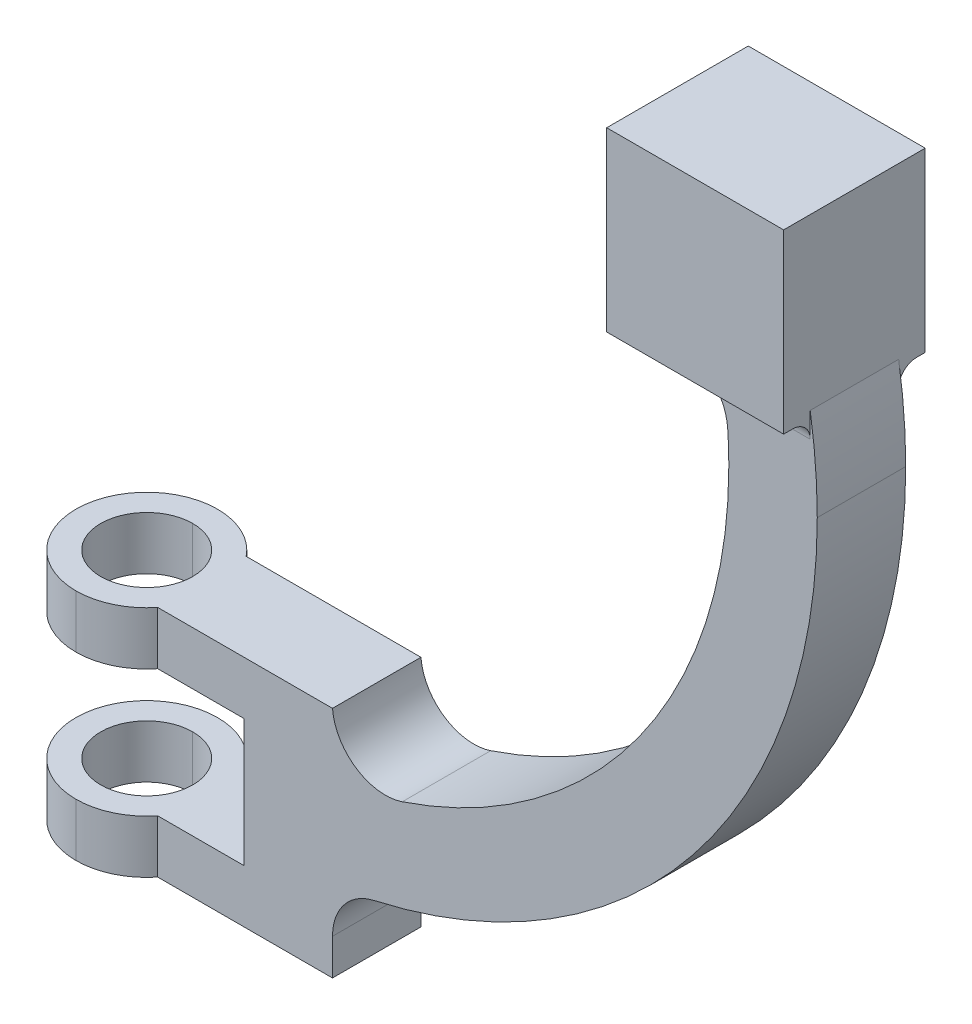
ISO-10303-21;
HEADER;
FILE_DESCRIPTION(('STEP AP214'),'2;1');
FILE_NAME('part.step','',(''),(''),'','','');
FILE_SCHEMA(('AUTOMOTIVE_DESIGN { 1 0 10303 214 1 1 1 1 }'));
ENDSEC;
DATA;
#1=APPLICATION_CONTEXT('core data for automotive mechanical design processes');
#2=APPLICATION_PROTOCOL_DEFINITION('international standard','automotive_design',2000,#1);
#3=PRODUCT_CONTEXT('',#1,'mechanical');
#4=PRODUCT('Part','Part','',(#3));
#5=PRODUCT_RELATED_PRODUCT_CATEGORY('part','',(#4));
#6=PRODUCT_DEFINITION_FORMATION('','',#4);
#7=PRODUCT_DEFINITION_CONTEXT('part definition',#1,'design');
#8=PRODUCT_DEFINITION('design','',#6,#7);
#9=PRODUCT_DEFINITION_SHAPE('','',#8);
#10=(LENGTH_UNIT() NAMED_UNIT(*) SI_UNIT(.MILLI.,.METRE.));
#11=(NAMED_UNIT(*) PLANE_ANGLE_UNIT() SI_UNIT($,.RADIAN.));
#12=(NAMED_UNIT(*) SI_UNIT($,.STERADIAN.) SOLID_ANGLE_UNIT());
#13=UNCERTAINTY_MEASURE_WITH_UNIT(LENGTH_MEASURE(1.E-05),#10,'distance_accuracy_value','');
#14=(GEOMETRIC_REPRESENTATION_CONTEXT(3) GLOBAL_UNCERTAINTY_ASSIGNED_CONTEXT((#13)) GLOBAL_UNIT_ASSIGNED_CONTEXT((#10,
#11,#12)) REPRESENTATION_CONTEXT('',''));
#15=CARTESIAN_POINT('',(0.,0.,0.));
#16=DIRECTION('',(0.,0.,1.));
#17=DIRECTION('',(1.,0.,0.));
#18=AXIS2_PLACEMENT_3D('',#15,#16,#17);
#19=CARTESIAN_POINT('',(24.3445862721124,31.2695526217005,-2.5));
#20=DIRECTION('',(0.,0.,1.));
#21=DIRECTION('',(1.,0.,0.));
#22=AXIS2_PLACEMENT_3D('',#19,#20,#21);
#23=CYLINDRICAL_SURFACE('',#22,3.);
#24=CARTESIAN_POINT('',(24.3445862721124,31.2695526217005,-2.5));
#25=DIRECTION('',(0.,0.,1.));
#26=DIRECTION('',(-1.,0.,0.));
#27=AXIS2_PLACEMENT_3D('',#24,#25,#26);
#28=CIRCLE('',#27,3.);
#29=CARTESIAN_POINT('',(27.3376388767794,31.4736018944161,-2.5));
#30=VERTEX_POINT('',#29);
#31=CARTESIAN_POINT('',(26.5806542496121,33.2695526217005,-2.5));
#32=VERTEX_POINT('',#31);
#33=EDGE_CURVE('E410',#30,#32,#28,.T.);
#34=ORIENTED_EDGE('',*,*,#33,.F.);
#35=DIRECTION('',(0.,0.,-1.));
#36=VECTOR('',#35,1.);
#37=CARTESIAN_POINT('',(27.3376388767794,31.4736018944161,-2.5));
#38=LINE('',#37,#36);
#39=CARTESIAN_POINT('',(27.3376388767794,31.4736018944161,2.5));
#40=VERTEX_POINT('',#39);
#41=EDGE_CURVE('E369',#40,#30,#38,.T.);
#42=ORIENTED_EDGE('',*,*,#41,.F.);
#43=CARTESIAN_POINT('',(24.3445862721124,31.2695526217005,2.5));
#44=DIRECTION('',(0.,0.,-1.));
#45=DIRECTION('',(1.,0.,0.));
#46=AXIS2_PLACEMENT_3D('',#43,#44,#45);
#47=CIRCLE('',#46,3.);
#48=CARTESIAN_POINT('',(26.5806542496121,33.2695526217005,2.5));
#49=VERTEX_POINT('',#48);
#50=EDGE_CURVE('E438',#49,#40,#47,.T.);
#51=ORIENTED_EDGE('',*,*,#50,.F.);
#52=CARTESIAN_POINT('',(26.5806542496121,33.2695526217005,2.5));
#53=CARTESIAN_POINT('',(26.5523435658199,33.3012104989178,2.50000455551072));
#54=CARTESIAN_POINT('',(26.5233748537477,33.3322400660775,2.50150263052097));
#55=CARTESIAN_POINT('',(26.4643136883192,33.3928847942062,2.50716698518481));
#56=CARTESIAN_POINT('',(26.4342227101048,33.4225017028365,2.51132987097531));
#57=CARTESIAN_POINT('',(26.3429064194618,33.5086788959668,2.52726423180945));
#58=CARTESIAN_POINT('',(26.2802051071374,33.5630474688072,2.5424913092058));
#59=CARTESIAN_POINT('',(26.1097307736497,33.6991139789296,2.592437017818));
#60=CARTESIAN_POINT('',(25.9994122176084,33.7752972547978,2.63338882471228));
#61=CARTESIAN_POINT('',(25.7733586349941,33.9107898996237,2.7281873059139));
#62=CARTESIAN_POINT('',(25.6575939980268,33.9699905357896,2.78211317833401));
#63=CARTESIAN_POINT('',(25.4568714388266,34.0572215456473,2.88145907332466));
#64=CARTESIAN_POINT('',(25.3726347395481,34.0893193025895,2.92486125147377));
#65=CARTESIAN_POINT('',(25.2030733912598,34.1454846238481,3.0146643361152));
#66=CARTESIAN_POINT('',(25.117748215783,34.1695481365092,3.06106674158013));
#67=CARTESIAN_POINT('',(24.8611483140865,34.2299555293475,3.20303658057069));
#68=CARTESIAN_POINT('',(24.6886679116238,34.2547628551567,3.30166601961782));
#69=CARTESIAN_POINT('',(24.4621293793442,34.267736667999,3.43214230188662));
#70=CARTESIAN_POINT('',(24.4081050532393,34.2693667879832,3.46332773518254));
#71=CARTESIAN_POINT('',(24.350910857615,34.269547619792,3.49634849414372));
#72=CARTESIAN_POINT('',(24.3477485783026,34.2695526195202,3.49817423684651));
#73=CARTESIAN_POINT('',(24.3445862721124,34.2695526217005,3.5));
#74=B_SPLINE_CURVE_WITH_KNOTS('',3,(#52,#53,#54,#55,#56,#57,#58,#59,#60,#61,#62,#63,#64,#65,#66,
#67,#68,#69,#70,#71,#72,#73),.UNSPECIFIED.,.F.,.F.,(4,2,2,2,2,2,2,2,2,2,4),(0.,
0.127328124372166,0.254494407314541,0.506902758847991,0.92515434749421,1.34602692875663,
1.64578712718784,1.94569826663473,2.54344782717996,2.73062158792369,2.74157604934411),.UNSPECIFIED.);
#75=CARTESIAN_POINT('',(24.3445862721124,34.2695526217005,3.5));
#76=VERTEX_POINT('',#75);
#77=EDGE_CURVE('E612',#49,#76,#74,.T.);
#78=ORIENTED_EDGE('',*,*,#77,.T.);
#79=DIRECTION('',(0.,0.,1.));
#80=VECTOR('',#79,1.);
#81=CARTESIAN_POINT('',(24.3445862721124,34.2695526217005,2.5));
#82=LINE('',#81,#80);
#83=CARTESIAN_POINT('',(24.3445862721124,34.2695526217005,-3.5));
#84=VERTEX_POINT('',#83);
#85=EDGE_CURVE('E310',#84,#76,#82,.T.);
#86=ORIENTED_EDGE('',*,*,#85,.F.);
#87=CARTESIAN_POINT('',(26.5806542496121,33.2695526217005,-2.5));
#88=CARTESIAN_POINT('',(26.5523435658199,33.3012104989178,-2.50000455551072));
#89=CARTESIAN_POINT('',(26.5233748537477,33.3322400660775,-2.50150263052097));
#90=CARTESIAN_POINT('',(26.4643136883192,33.3928847942062,-2.50716698518481));
#91=CARTESIAN_POINT('',(26.4342227101048,33.4225017028365,-2.51132987097531));
#92=CARTESIAN_POINT('',(26.3429064194618,33.5086788959668,-2.52726423180945));
#93=CARTESIAN_POINT('',(26.2802051071374,33.5630474688072,-2.5424913092058));
#94=CARTESIAN_POINT('',(26.1097307736497,33.6991139789296,-2.592437017818));
#95=CARTESIAN_POINT('',(25.9994122176084,33.7752972547978,-2.63338882471228));
#96=CARTESIAN_POINT('',(25.7733586349941,33.9107898996237,-2.7281873059139));
#97=CARTESIAN_POINT('',(25.6575939980268,33.9699905357896,-2.78211317833401));
#98=CARTESIAN_POINT('',(25.4568714388266,34.0572215456473,-2.88145907332466));
#99=CARTESIAN_POINT('',(25.3726347395481,34.0893193025895,-2.92486125147377));
#100=CARTESIAN_POINT('',(25.2030733912598,34.1454846238481,-3.0146643361152));
#101=CARTESIAN_POINT('',(25.117748215783,34.1695481365092,-3.06106674158013));
#102=CARTESIAN_POINT('',(24.8611483140865,34.2299555293475,-3.20303658057069));
#103=CARTESIAN_POINT('',(24.6886679116238,34.2547628551567,-3.30166601961782));
#104=CARTESIAN_POINT('',(24.4621293793442,34.267736667999,-3.43214230188662));
#105=CARTESIAN_POINT('',(24.4081050532393,34.2693667879832,-3.46332773518254));
#106=CARTESIAN_POINT('',(24.350910857615,34.269547619792,-3.49634849414372));
#107=CARTESIAN_POINT('',(24.3477485783026,34.2695526195202,-3.49817423684651));
#108=CARTESIAN_POINT('',(24.3445862721124,34.2695526217005,-3.5));
#109=B_SPLINE_CURVE_WITH_KNOTS('',3,(#87,#88,#89,#90,#91,#92,#93,#94,#95,#96,#97,#98,#99,#100,
#101,#102,#103,#104,#105,#106,#107,#108),.UNSPECIFIED.,.F.,.F.,(4,2,2,2,2,2,2,2,2,2,4),(0.,
0.127328124372166,0.254494407314541,0.506902758847991,0.92515434749421,1.34602692875663,
1.64578712718784,1.94569826663473,2.54344782717996,2.73062158792369,2.74157604934411),.UNSPECIFIED.);
#110=EDGE_CURVE('E56',#84,#32,#109,.F.);
#111=ORIENTED_EDGE('',*,*,#110,.T.);
#112=EDGE_LOOP('',(#34,#42,#51,#78,#86,#111));
#113=FACE_BOUND('',#112,.T.);
#114=ADVANCED_FACE('F47',(#113),#23,.F.);
#115=CARTESIAN_POINT('',(7.99027700327415,6.84133678478349,-2.5));
#116=DIRECTION('',(0.,0.,1.));
#117=DIRECTION('',(1.,0.,0.));
#118=AXIS2_PLACEMENT_3D('',#115,#116,#117);
#119=CYLINDRICAL_SURFACE('',#118,3.);
#120=CARTESIAN_POINT('',(7.99027700327415,6.84133678478349,-2.5));
#121=DIRECTION('',(0.,0.,1.));
#122=DIRECTION('',(-1.,0.,0.));
#123=AXIS2_PLACEMENT_3D('',#120,#121,#122);
#124=CIRCLE('',#123,3.);
#125=CARTESIAN_POINT('',(5.,6.6,-2.5));
#126=VERTEX_POINT('',#125);
#127=CARTESIAN_POINT('',(8.94201980309237,3.99630855241143,-2.5));
#128=VERTEX_POINT('',#127);
#129=EDGE_CURVE('E361',#126,#128,#124,.T.);
#130=ORIENTED_EDGE('',*,*,#129,.F.);
#131=DIRECTION('',(0.,0.,-1.));
#132=VECTOR('',#131,1.);
#133=CARTESIAN_POINT('',(5.,6.6,2.5));
#134=LINE('',#133,#132);
#135=CARTESIAN_POINT('',(5.,6.6,2.5));
#136=VERTEX_POINT('',#135);
#137=EDGE_CURVE('E344',#136,#126,#134,.T.);
#138=ORIENTED_EDGE('',*,*,#137,.F.);
#139=CARTESIAN_POINT('',(7.99027700327415,6.84133678478349,2.5));
#140=DIRECTION('',(0.,0.,-1.));
#141=DIRECTION('',(1.,0.,0.));
#142=AXIS2_PLACEMENT_3D('',#139,#140,#141);
#143=CIRCLE('',#142,3.);
#144=CARTESIAN_POINT('',(8.94201980309237,3.99630855241143,2.5));
#145=VERTEX_POINT('',#144);
#146=EDGE_CURVE('E487',#145,#136,#143,.T.);
#147=ORIENTED_EDGE('',*,*,#146,.F.);
#148=DIRECTION('',(0.,0.,1.));
#149=VECTOR('',#148,1.);
#150=CARTESIAN_POINT('',(8.94201980309237,3.99630855241142,-2.5));
#151=LINE('',#150,#149);
#152=EDGE_CURVE('E464',#128,#145,#151,.T.);
#153=ORIENTED_EDGE('',*,*,#152,.F.);
#154=EDGE_LOOP('',(#130,#138,#147,#153));
#155=FACE_BOUND('',#154,.T.);
#156=ADVANCED_FACE('F655',(#155),#119,.F.);
#157=CARTESIAN_POINT('',(8.,-4.55824954074391,-2.5));
#158=DIRECTION('',(0.,0.,1.));
#159=DIRECTION('',(1.,0.,0.));
#160=AXIS2_PLACEMENT_3D('',#157,#158,#159);
#161=CYLINDRICAL_SURFACE('',#160,3.);
#162=CARTESIAN_POINT('',(8.,-4.55824954074391,-2.5));
#163=DIRECTION('',(0.,0.,1.));
#164=DIRECTION('',(-1.,0.,0.));
#165=AXIS2_PLACEMENT_3D('',#162,#163,#164);
#166=CIRCLE('',#165,3.);
#167=CARTESIAN_POINT('',(7.34624478397976,-1.63034856606489,-2.5));
#168=VERTEX_POINT('',#167);
#169=CARTESIAN_POINT('',(5.,-4.55824954074391,-2.5));
#170=VERTEX_POINT('',#169);
#171=EDGE_CURVE('E422',#168,#170,#166,.T.);
#172=ORIENTED_EDGE('',*,*,#171,.F.);
#173=DIRECTION('',(0.,0.,-1.));
#174=VECTOR('',#173,1.);
#175=CARTESIAN_POINT('',(7.34624478397976,-1.63034856606489,-2.5));
#176=LINE('',#175,#174);
#177=CARTESIAN_POINT('',(7.34624478397976,-1.63034856606489,2.5));
#178=VERTEX_POINT('',#177);
#179=EDGE_CURVE('E367',#178,#168,#176,.T.);
#180=ORIENTED_EDGE('',*,*,#179,.F.);
#181=CARTESIAN_POINT('',(8.,-4.55824954074391,2.5));
#182=DIRECTION('',(0.,0.,-1.));
#183=DIRECTION('',(1.,0.,0.));
#184=AXIS2_PLACEMENT_3D('',#181,#182,#183);
#185=CIRCLE('',#184,3.);
#186=CARTESIAN_POINT('',(5.,-4.55824954074391,2.5));
#187=VERTEX_POINT('',#186);
#188=EDGE_CURVE('E451',#187,#178,#185,.T.);
#189=ORIENTED_EDGE('',*,*,#188,.F.);
#190=DIRECTION('',(0.,0.,1.));
#191=VECTOR('',#190,1.);
#192=CARTESIAN_POINT('',(5.,-4.55824954074391,2.5));
#193=LINE('',#192,#191);
#194=EDGE_CURVE('E515',#170,#187,#193,.T.);
#195=ORIENTED_EDGE('',*,*,#194,.F.);
#196=EDGE_LOOP('',(#172,#180,#189,#195));
#197=FACE_BOUND('',#196,.T.);
#198=ADVANCED_FACE('F661',(#197),#161,.F.);
#199=CARTESIAN_POINT('',(22.,34.2695526217005,-2.5));
#200=DIRECTION('',(-1.,0.,0.));
#201=DIRECTION('',(0.,0.,1.));
#202=AXIS2_PLACEMENT_3D('',#199,#200,#201);
#203=PLANE('',#202);
#204=DIRECTION('',(0.,1.,0.));
#205=VECTOR('',#204,1.);
#206=CARTESIAN_POINT('',(22.,44.2695526217005,-4.));
#207=LINE('',#206,#205);
#208=CARTESIAN_POINT('',(22.,34.2695526217005,-4.));
#209=VERTEX_POINT('',#208);
#210=CARTESIAN_POINT('',(22.,44.2695526217005,-4.));
#211=VERTEX_POINT('',#210);
#212=EDGE_CURVE('E303',#209,#211,#207,.T.);
#213=ORIENTED_EDGE('',*,*,#212,.F.);
#214=DIRECTION('',(0.,0.,1.));
#215=VECTOR('',#214,1.);
#216=CARTESIAN_POINT('',(22.,34.2695526217005,-2.5));
#217=LINE('',#216,#215);
#218=CARTESIAN_POINT('',(22.,34.2695526217005,4.));
#219=VERTEX_POINT('',#218);
#220=EDGE_CURVE('E297',#209,#219,#217,.T.);
#221=ORIENTED_EDGE('',*,*,#220,.T.);
#222=DIRECTION('',(0.,-1.,0.));
#223=VECTOR('',#222,1.);
#224=CARTESIAN_POINT('',(22.,44.2695526217005,4.));
#225=LINE('',#224,#223);
#226=CARTESIAN_POINT('',(22.,44.2695526217005,4.));
#227=VERTEX_POINT('',#226);
#228=EDGE_CURVE('E300',#227,#219,#225,.T.);
#229=ORIENTED_EDGE('',*,*,#228,.F.);
#230=DIRECTION('',(0.,0.,1.));
#231=VECTOR('',#230,1.);
#232=CARTESIAN_POINT('',(22.,44.2695526217005,-2.5));
#233=LINE('',#232,#231);
#234=EDGE_CURVE('E349',#211,#227,#233,.T.);
#235=ORIENTED_EDGE('',*,*,#234,.F.);
#236=EDGE_LOOP('',(#213,#221,#229,#235));
#237=FACE_BOUND('',#236,.T.);
#238=ADVANCED_FACE('F299',(#237),#203,.T.);
#239=CARTESIAN_POINT('',(22.,34.2695526217005,-2.5));
#240=DIRECTION('',(0.,-1.,0.));
#241=DIRECTION('',(0.,0.,-1.));
#242=AXIS2_PLACEMENT_3D('',#239,#240,#241);
#243=PLANE('',#242);
#244=ORIENTED_EDGE('',*,*,#85,.T.);
#245=DIRECTION('',(1.,0.,0.));
#246=VECTOR('',#245,1.);
#247=CARTESIAN_POINT('',(32.,34.2695526217005,3.5));
#248=LINE('',#247,#246);
#249=CARTESIAN_POINT('',(32.,34.2695526217005,3.5));
#250=VERTEX_POINT('',#249);
#251=EDGE_CURVE('E603',#76,#250,#248,.T.);
#252=ORIENTED_EDGE('',*,*,#251,.T.);
#253=DIRECTION('',(0.,0.,-1.));
#254=VECTOR('',#253,1.);
#255=CARTESIAN_POINT('',(32.,34.2695526217005,4.));
#256=LINE('',#255,#254);
#257=CARTESIAN_POINT('',(32.,34.2695526217005,4.));
#258=VERTEX_POINT('',#257);
#259=EDGE_CURVE('E325',#258,#250,#256,.T.);
#260=ORIENTED_EDGE('',*,*,#259,.F.);
#261=DIRECTION('',(1.,0.,0.));
#262=VECTOR('',#261,1.);
#263=CARTESIAN_POINT('',(22.,34.2695526217005,4.));
#264=LINE('',#263,#262);
#265=EDGE_CURVE('E316',#219,#258,#264,.T.);
#266=ORIENTED_EDGE('',*,*,#265,.F.);
#267=ORIENTED_EDGE('',*,*,#220,.F.);
#268=DIRECTION('',(1.,0.,0.));
#269=VECTOR('',#268,1.);
#270=CARTESIAN_POINT('',(22.,34.2695526217005,-4.));
#271=LINE('',#270,#269);
#272=CARTESIAN_POINT('',(32.,34.2695526217005,-4.));
#273=VERTEX_POINT('',#272);
#274=EDGE_CURVE('E326',#209,#273,#271,.T.);
#275=ORIENTED_EDGE('',*,*,#274,.T.);
#276=CARTESIAN_POINT('',(32.,34.2695526217005,-3.5));
#277=VERTEX_POINT('',#276);
#278=EDGE_CURVE('E683',#277,#273,#256,.T.);
#279=ORIENTED_EDGE('',*,*,#278,.F.);
#280=DIRECTION('',(-1.,0.,0.));
#281=VECTOR('',#280,1.);
#282=CARTESIAN_POINT('',(24.3445862721124,34.2695526217005,-3.5));
#283=LINE('',#282,#281);
#284=EDGE_CURVE('E309',#277,#84,#283,.T.);
#285=ORIENTED_EDGE('',*,*,#284,.T.);
#286=EDGE_LOOP('',(#244,#252,#260,#266,#267,#275,#279,#285));
#287=FACE_BOUND('',#286,.T.);
#288=ADVANCED_FACE('F322',(#287),#243,.T.);
#289=CARTESIAN_POINT('',(0.365223689149773,29.6347763108502,-2.5));
#290=DIRECTION('',(0.,0.,1.));
#291=DIRECTION('',(1.,0.,0.));
#292=AXIS2_PLACEMENT_3D('',#289,#290,#291);
#293=CYLINDRICAL_SURFACE('',#292,27.0350228514911);
#294=DIRECTION('',(0.,0.,1.));
#295=VECTOR('',#294,1.);
#296=CARTESIAN_POINT('',(27.4002465406409,29.6347763108502,-2.5));
#297=LINE('',#296,#295);
#298=CARTESIAN_POINT('',(27.4002465406409,29.6347763108502,-2.5));
#299=VERTEX_POINT('',#298);
#300=CARTESIAN_POINT('',(27.4002465406409,29.6347763108502,2.5));
#301=VERTEX_POINT('',#300);
#302=EDGE_CURVE('E378',#299,#301,#297,.T.);
#303=ORIENTED_EDGE('',*,*,#302,.F.);
#304=CARTESIAN_POINT('',(0.365223689149773,29.6347763108502,-2.5));
#305=DIRECTION('',(0.,0.,-1.));
#306=DIRECTION('',(-1.,0.,0.));
#307=AXIS2_PLACEMENT_3D('',#304,#305,#306);
#308=CIRCLE('',#307,27.0350228514911);
#309=EDGE_CURVE('E382',#299,#128,#308,.T.);
#310=ORIENTED_EDGE('',*,*,#309,.T.);
#311=ORIENTED_EDGE('',*,*,#152,.T.);
#312=CARTESIAN_POINT('',(0.365223689149773,29.6347763108502,2.5));
#313=DIRECTION('',(0.,0.,-1.));
#314=DIRECTION('',(-1.,0.,0.));
#315=AXIS2_PLACEMENT_3D('',#312,#313,#314);
#316=CIRCLE('',#315,27.0350228514911);
#317=EDGE_CURVE('E441',#301,#145,#316,.T.);
#318=ORIENTED_EDGE('',*,*,#317,.F.);
#319=EDGE_LOOP('',(#303,#310,#311,#318));
#320=FACE_BOUND('',#319,.T.);
#321=ADVANCED_FACE('F676',(#320),#293,.F.);
#322=CARTESIAN_POINT('',(0.365223689149773,29.6347763108502,-2.5));
#323=DIRECTION('',(0.,0.,1.));
#324=DIRECTION('',(1.,0.,0.));
#325=AXIS2_PLACEMENT_3D('',#322,#323,#324);
#326=CYLINDRICAL_SURFACE('',#325,32.0350228514911);
#327=DIRECTION('',(0.,0.,1.));
#328=VECTOR('',#327,1.);
#329=CARTESIAN_POINT('',(32.4002465406409,29.6347763108502,-2.5));
#330=LINE('',#329,#328);
#331=CARTESIAN_POINT('',(32.4002465406409,29.6347763108502,-2.5));
#332=VERTEX_POINT('',#331);
#333=CARTESIAN_POINT('',(32.4002465406409,29.6347763108502,2.5));
#334=VERTEX_POINT('',#333);
#335=EDGE_CURVE('E368',#332,#334,#330,.T.);
#336=ORIENTED_EDGE('',*,*,#335,.F.);
#337=CARTESIAN_POINT('',(0.365223689149773,29.6347763108502,-2.5));
#338=DIRECTION('',(0.,0.,1.));
#339=DIRECTION('',(-1.,0.,0.));
#340=AXIS2_PLACEMENT_3D('',#337,#338,#339);
#341=CIRCLE('',#340,32.0350228514911);
#342=CARTESIAN_POINT('',(32.,34.6829063466187,-2.5));
#343=VERTEX_POINT('',#342);
#344=EDGE_CURVE('E399',#332,#343,#341,.T.);
#345=ORIENTED_EDGE('',*,*,#344,.T.);
#346=DIRECTION('',(0.,0.,1.));
#347=VECTOR('',#346,1.);
#348=CARTESIAN_POINT('',(32.,34.6829063466187,-2.5));
#349=LINE('',#348,#347);
#350=CARTESIAN_POINT('',(32.,34.6829063466187,2.5));
#351=VERTEX_POINT('',#350);
#352=EDGE_CURVE('E356',#343,#351,#349,.T.);
#353=ORIENTED_EDGE('',*,*,#352,.T.);
#354=CARTESIAN_POINT('',(0.365223689149773,29.6347763108502,2.5));
#355=DIRECTION('',(0.,0.,1.));
#356=DIRECTION('',(-1.,0.,0.));
#357=AXIS2_PLACEMENT_3D('',#354,#355,#356);
#358=CIRCLE('',#357,32.0350228514911);
#359=EDGE_CURVE('E446',#334,#351,#358,.T.);
#360=ORIENTED_EDGE('',*,*,#359,.F.);
#361=EDGE_LOOP('',(#336,#345,#353,#360));
#362=FACE_BOUND('',#361,.T.);
#363=ADVANCED_FACE('F702',(#362),#326,.T.);
#364=CARTESIAN_POINT('',(32.,44.2695526217005,-2.5));
#365=DIRECTION('',(1.,0.,0.));
#366=DIRECTION('',(0.,1.,0.));
#367=AXIS2_PLACEMENT_3D('',#364,#365,#366);
#368=PLANE('',#367);
#369=DIRECTION('',(0.,-1.,0.));
#370=VECTOR('',#369,1.);
#371=CARTESIAN_POINT('',(32.,-3.6,-2.5));
#372=LINE('',#371,#370);
#373=CARTESIAN_POINT('',(32.,33.2695526217005,-2.5));
#374=VERTEX_POINT('',#373);
#375=EDGE_CURVE('E62',#343,#374,#372,.T.);
#376=ORIENTED_EDGE('',*,*,#375,.T.);
#377=CARTESIAN_POINT('',(32.,33.2695526217005,-3.5));
#378=DIRECTION('',(1.,0.,0.));
#379=DIRECTION('',(0.,0.,-1.));
#380=AXIS2_PLACEMENT_3D('',#377,#378,#379);
#381=CIRCLE('',#380,1.);
#382=EDGE_CURVE('E11',#374,#277,#381,.F.);
#383=ORIENTED_EDGE('',*,*,#382,.T.);
#384=ORIENTED_EDGE('',*,*,#278,.T.);
#385=DIRECTION('',(0.,1.,0.));
#386=VECTOR('',#385,1.);
#387=CARTESIAN_POINT('',(32.,44.2695526217005,-4.));
#388=LINE('',#387,#386);
#389=CARTESIAN_POINT('',(32.,44.2695526217005,-4.));
#390=VERTEX_POINT('',#389);
#391=EDGE_CURVE('E320',#273,#390,#388,.T.);
#392=ORIENTED_EDGE('',*,*,#391,.T.);
#393=DIRECTION('',(0.,0.,1.));
#394=VECTOR('',#393,1.);
#395=CARTESIAN_POINT('',(32.,44.2695526217005,-2.5));
#396=LINE('',#395,#394);
#397=CARTESIAN_POINT('',(32.,44.2695526217005,4.));
#398=VERTEX_POINT('',#397);
#399=EDGE_CURVE('E352',#390,#398,#396,.T.);
#400=ORIENTED_EDGE('',*,*,#399,.T.);
#401=DIRECTION('',(0.,-1.,0.));
#402=VECTOR('',#401,1.);
#403=CARTESIAN_POINT('',(32.,44.2695526217005,4.));
#404=LINE('',#403,#402);
#405=EDGE_CURVE('E682',#398,#258,#404,.T.);
#406=ORIENTED_EDGE('',*,*,#405,.T.);
#407=ORIENTED_EDGE('',*,*,#259,.T.);
#408=CARTESIAN_POINT('',(32.,33.2695526217005,3.5));
#409=DIRECTION('',(1.,0.,0.));
#410=DIRECTION('',(0.,0.,-1.));
#411=AXIS2_PLACEMENT_3D('',#408,#409,#410);
#412=CIRCLE('',#411,1.);
#413=CARTESIAN_POINT('',(32.,33.2695526217005,2.5));
#414=VERTEX_POINT('',#413);
#415=EDGE_CURVE('E609',#250,#414,#412,.F.);
#416=ORIENTED_EDGE('',*,*,#415,.T.);
#417=DIRECTION('',(0.,1.,0.));
#418=VECTOR('',#417,1.);
#419=CARTESIAN_POINT('',(32.,-3.6,2.5));
#420=LINE('',#419,#418);
#421=EDGE_CURVE('E333',#414,#351,#420,.T.);
#422=ORIENTED_EDGE('',*,*,#421,.T.);
#423=ORIENTED_EDGE('',*,*,#352,.F.);
#424=EDGE_LOOP('',(#376,#383,#384,#392,#400,#406,#407,#416,#422,#423));
#425=FACE_BOUND('',#424,.T.);
#426=ADVANCED_FACE('F681',(#425),#368,.T.);
#427=CARTESIAN_POINT('',(22.,44.2695526217005,-2.5));
#428=DIRECTION('',(0.,1.,0.));
#429=DIRECTION('',(1.,0.,0.));
#430=AXIS2_PLACEMENT_3D('',#427,#428,#429);
#431=PLANE('',#430);
#432=ORIENTED_EDGE('',*,*,#234,.T.);
#433=DIRECTION('',(1.,0.,0.));
#434=VECTOR('',#433,1.);
#435=CARTESIAN_POINT('',(22.,44.2695526217005,4.));
#436=LINE('',#435,#434);
#437=EDGE_CURVE('E319',#227,#398,#436,.T.);
#438=ORIENTED_EDGE('',*,*,#437,.T.);
#439=ORIENTED_EDGE('',*,*,#399,.F.);
#440=DIRECTION('',(1.,0.,0.));
#441=VECTOR('',#440,1.);
#442=CARTESIAN_POINT('',(22.,44.2695526217005,-4.));
#443=LINE('',#442,#441);
#444=EDGE_CURVE('E328',#211,#390,#443,.T.);
#445=ORIENTED_EDGE('',*,*,#444,.F.);
#446=EDGE_LOOP('',(#432,#438,#439,#445));
#447=FACE_BOUND('',#446,.T.);
#448=ADVANCED_FACE('F694',(#447),#431,.T.);
#449=CARTESIAN_POINT('',(-8.,-6.6,0.));
#450=DIRECTION('',(0.,1.,0.));
#451=DIRECTION('',(0.,0.,1.));
#452=AXIS2_PLACEMENT_3D('',#449,#450,#451);
#453=CYLINDRICAL_SURFACE('',#452,2.6);
#454=DIRECTION('',(0.,1.,0.));
#455=VECTOR('',#454,1.);
#456=CARTESIAN_POINT('',(-8.,-6.6,-2.6));
#457=LINE('',#456,#455);
#458=CARTESIAN_POINT('',(-8.,-6.6,-2.6));
#459=VERTEX_POINT('',#458);
#460=CARTESIAN_POINT('',(-8.,-3.6,-2.6));
#461=VERTEX_POINT('',#460);
#462=EDGE_CURVE('E556',#459,#461,#457,.T.);
#463=ORIENTED_EDGE('',*,*,#462,.F.);
#464=CARTESIAN_POINT('',(-8.,-6.6,0.));
#465=DIRECTION('',(0.,-1.,0.));
#466=DIRECTION('',(0.,0.,-1.));
#467=AXIS2_PLACEMENT_3D('',#464,#465,#466);
#468=CIRCLE('',#467,2.6);
#469=CARTESIAN_POINT('',(-8.,-6.6,2.6));
#470=VERTEX_POINT('',#469);
#471=EDGE_CURVE('E389',#459,#470,#468,.T.);
#472=ORIENTED_EDGE('',*,*,#471,.T.);
#473=DIRECTION('',(0.,1.,0.));
#474=VECTOR('',#473,1.);
#475=CARTESIAN_POINT('',(-8.,-6.6,2.6));
#476=LINE('',#475,#474);
#477=CARTESIAN_POINT('',(-8.,-3.6,2.6));
#478=VERTEX_POINT('',#477);
#479=EDGE_CURVE('E411',#470,#478,#476,.T.);
#480=ORIENTED_EDGE('',*,*,#479,.T.);
#481=CARTESIAN_POINT('',(-8.,-3.6,0.));
#482=DIRECTION('',(0.,-1.,0.));
#483=DIRECTION('',(0.,0.,-1.));
#484=AXIS2_PLACEMENT_3D('',#481,#482,#483);
#485=CIRCLE('',#484,2.6);
#486=EDGE_CURVE('E353',#461,#478,#485,.T.);
#487=ORIENTED_EDGE('',*,*,#486,.F.);
#488=EDGE_LOOP('',(#463,#472,#480,#487));
#489=FACE_BOUND('',#488,.T.);
#490=ADVANCED_FACE('F747',(#489),#453,.F.);
#491=CARTESIAN_POINT('',(-8.,-6.6,0.));
#492=DIRECTION('',(0.,1.,0.));
#493=DIRECTION('',(0.,0.,1.));
#494=AXIS2_PLACEMENT_3D('',#491,#492,#493);
#495=CYLINDRICAL_SURFACE('',#494,4.);
#496=DIRECTION('',(0.,1.,0.));
#497=VECTOR('',#496,1.);
#498=CARTESIAN_POINT('',(-8.,-6.6,4.));
#499=LINE('',#498,#497);
#500=CARTESIAN_POINT('',(-8.,-6.6,4.));
#501=VERTEX_POINT('',#500);
#502=CARTESIAN_POINT('',(-8.,-3.6,4.));
#503=VERTEX_POINT('',#502);
#504=EDGE_CURVE('E390',#501,#503,#499,.T.);
#505=ORIENTED_EDGE('',*,*,#504,.F.);
#506=CARTESIAN_POINT('',(-8.,-6.6,0.));
#507=DIRECTION('',(0.,-1.,0.));
#508=DIRECTION('',(0.,0.,-1.));
#509=AXIS2_PLACEMENT_3D('',#506,#507,#508);
#510=CIRCLE('',#509,4.);
#511=CARTESIAN_POINT('',(-4.8775010008008,-6.6,2.5));
#512=VERTEX_POINT('',#511);
#513=EDGE_CURVE('E432',#512,#501,#510,.T.);
#514=ORIENTED_EDGE('',*,*,#513,.F.);
#515=DIRECTION('',(0.,1.,0.));
#516=VECTOR('',#515,1.);
#517=CARTESIAN_POINT('',(-4.8775010008008,-6.6,2.5));
#518=LINE('',#517,#516);
#519=CARTESIAN_POINT('',(-4.8775010008008,-3.6,2.5));
#520=VERTEX_POINT('',#519);
#521=EDGE_CURVE('E496',#512,#520,#518,.T.);
#522=ORIENTED_EDGE('',*,*,#521,.T.);
#523=CARTESIAN_POINT('',(-8.,-3.6,0.));
#524=DIRECTION('',(0.,-1.,0.));
#525=DIRECTION('',(0.,0.,-1.));
#526=AXIS2_PLACEMENT_3D('',#523,#524,#525);
#527=CIRCLE('',#526,4.);
#528=EDGE_CURVE('E386',#520,#503,#527,.T.);
#529=ORIENTED_EDGE('',*,*,#528,.T.);
#530=EDGE_LOOP('',(#505,#514,#522,#529));
#531=FACE_BOUND('',#530,.T.);
#532=ADVANCED_FACE('F744',(#531),#495,.T.);
#533=CARTESIAN_POINT('',(-8.,-3.6,0.));
#534=DIRECTION('',(0.,-1.,0.));
#535=DIRECTION('',(0.,0.,-1.));
#536=AXIS2_PLACEMENT_3D('',#533,#534,#535);
#537=PLANE('',#536);
#538=CARTESIAN_POINT('',(-8.,-3.6,0.));
#539=DIRECTION('',(0.,-1.,0.));
#540=DIRECTION('',(0.,0.,-1.));
#541=AXIS2_PLACEMENT_3D('',#538,#539,#540);
#542=CIRCLE('',#541,2.6);
#543=EDGE_CURVE('E416',#478,#461,#542,.T.);
#544=ORIENTED_EDGE('',*,*,#543,.T.);
#545=ORIENTED_EDGE('',*,*,#486,.T.);
#546=EDGE_LOOP('',(#544,#545));
#547=FACE_BOUND('',#546,.T.);
#548=DIRECTION('',(0.,0.,1.));
#549=VECTOR('',#548,1.);
#550=CARTESIAN_POINT('',(0.,-3.6,2.5));
#551=LINE('',#550,#549);
#552=CARTESIAN_POINT('',(0.,-3.6,-2.5));
#553=VERTEX_POINT('',#552);
#554=CARTESIAN_POINT('',(0.,-3.6,2.5));
#555=VERTEX_POINT('',#554);
#556=EDGE_CURVE('E529',#553,#555,#551,.T.);
#557=ORIENTED_EDGE('',*,*,#556,.F.);
#558=DIRECTION('',(1.,0.,0.));
#559=VECTOR('',#558,1.);
#560=CARTESIAN_POINT('',(-4.8775010008008,-3.6,-2.5));
#561=LINE('',#560,#559);
#562=CARTESIAN_POINT('',(-4.8775010008008,-3.6,-2.5));
#563=VERTEX_POINT('',#562);
#564=EDGE_CURVE('E406',#563,#553,#561,.T.);
#565=ORIENTED_EDGE('',*,*,#564,.F.);
#566=CARTESIAN_POINT('',(-8.,-3.6,0.));
#567=DIRECTION('',(0.,-1.,0.));
#568=DIRECTION('',(0.,0.,-1.));
#569=AXIS2_PLACEMENT_3D('',#566,#567,#568);
#570=CIRCLE('',#569,4.);
#571=CARTESIAN_POINT('',(-8.,-3.6,-4.));
#572=VERTEX_POINT('',#571);
#573=EDGE_CURVE('E472',#572,#563,#570,.T.);
#574=ORIENTED_EDGE('',*,*,#573,.F.);
#575=CARTESIAN_POINT('',(-8.,-3.6,0.));
#576=DIRECTION('',(0.,-1.,0.));
#577=DIRECTION('',(0.,0.,-1.));
#578=AXIS2_PLACEMENT_3D('',#575,#576,#577);
#579=CIRCLE('',#578,4.);
#580=EDGE_CURVE('E394',#503,#572,#579,.T.);
#581=ORIENTED_EDGE('',*,*,#580,.F.);
#582=ORIENTED_EDGE('',*,*,#528,.F.);
#583=DIRECTION('',(-1.,0.,0.));
#584=VECTOR('',#583,1.);
#585=CARTESIAN_POINT('',(5.,-3.6,2.5));
#586=LINE('',#585,#584);
#587=EDGE_CURVE('E501',#555,#520,#586,.T.);
#588=ORIENTED_EDGE('',*,*,#587,.F.);
#589=EDGE_LOOP('',(#557,#565,#574,#581,#582,#588));
#590=FACE_BOUND('',#589,.T.);
#591=ADVANCED_FACE('F719',(#547,#590),#537,.F.);
#592=CARTESIAN_POINT('',(-8.,-6.6,0.));
#593=DIRECTION('',(0.,-1.,0.));
#594=DIRECTION('',(0.,0.,-1.));
#595=AXIS2_PLACEMENT_3D('',#592,#593,#594);
#596=PLANE('',#595);
#597=CARTESIAN_POINT('',(-8.,-6.6,0.));
#598=DIRECTION('',(0.,-1.,0.));
#599=DIRECTION('',(0.,0.,-1.));
#600=AXIS2_PLACEMENT_3D('',#597,#598,#599);
#601=CIRCLE('',#600,2.6);
#602=EDGE_CURVE('E560',#470,#459,#601,.T.);
#603=ORIENTED_EDGE('',*,*,#602,.F.);
#604=ORIENTED_EDGE('',*,*,#471,.F.);
#605=EDGE_LOOP('',(#603,#604));
#606=FACE_BOUND('',#605,.T.);
#607=DIRECTION('',(0.,0.,1.));
#608=VECTOR('',#607,1.);
#609=CARTESIAN_POINT('',(5.,-6.6,0.));
#610=LINE('',#609,#608);
#611=CARTESIAN_POINT('',(5.,-6.6,-2.5));
#612=VERTEX_POINT('',#611);
#613=CARTESIAN_POINT('',(5.,-6.6,2.5));
#614=VERTEX_POINT('',#613);
#615=EDGE_CURVE('E442',#612,#614,#610,.T.);
#616=ORIENTED_EDGE('',*,*,#615,.T.);
#617=DIRECTION('',(-1.,0.,0.));
#618=VECTOR('',#617,1.);
#619=CARTESIAN_POINT('',(5.,-6.6,2.5));
#620=LINE('',#619,#618);
#621=EDGE_CURVE('E500',#614,#512,#620,.T.);
#622=ORIENTED_EDGE('',*,*,#621,.T.);
#623=ORIENTED_EDGE('',*,*,#513,.T.);
#624=CARTESIAN_POINT('',(-8.,-6.6,0.));
#625=DIRECTION('',(0.,-1.,0.));
#626=DIRECTION('',(0.,0.,-1.));
#627=AXIS2_PLACEMENT_3D('',#624,#625,#626);
#628=CIRCLE('',#627,4.);
#629=CARTESIAN_POINT('',(-8.,-6.6,-4.));
#630=VERTEX_POINT('',#629);
#631=EDGE_CURVE('E395',#501,#630,#628,.T.);
#632=ORIENTED_EDGE('',*,*,#631,.T.);
#633=CARTESIAN_POINT('',(-8.,-6.6,0.));
#634=DIRECTION('',(0.,-1.,0.));
#635=DIRECTION('',(0.,0.,-1.));
#636=AXIS2_PLACEMENT_3D('',#633,#634,#635);
#637=CIRCLE('',#636,4.);
#638=CARTESIAN_POINT('',(-4.8775010008008,-6.6,-2.5));
#639=VERTEX_POINT('',#638);
#640=EDGE_CURVE('E415',#630,#639,#637,.T.);
#641=ORIENTED_EDGE('',*,*,#640,.T.);
#642=DIRECTION('',(1.,0.,0.));
#643=VECTOR('',#642,1.);
#644=CARTESIAN_POINT('',(-4.8775010008008,-6.6,-2.5));
#645=LINE('',#644,#643);
#646=EDGE_CURVE('E421',#639,#612,#645,.T.);
#647=ORIENTED_EDGE('',*,*,#646,.T.);
#648=EDGE_LOOP('',(#616,#622,#623,#632,#641,#647));
#649=FACE_BOUND('',#648,.T.);
#650=ADVANCED_FACE('F711',(#606,#649),#596,.T.);
#651=CARTESIAN_POINT('',(-8.,6.6,0.));
#652=DIRECTION('',(0.,-1.,0.));
#653=DIRECTION('',(0.,0.,-1.));
#654=AXIS2_PLACEMENT_3D('',#651,#652,#653);
#655=CYLINDRICAL_SURFACE('',#654,2.6);
#656=DIRECTION('',(0.,-1.,0.));
#657=VECTOR('',#656,1.);
#658=CARTESIAN_POINT('',(-8.,6.6,2.6));
#659=LINE('',#658,#657);
#660=CARTESIAN_POINT('',(-8.,6.6,2.6));
#661=VERTEX_POINT('',#660);
#662=CARTESIAN_POINT('',(-8.,3.6,2.6));
#663=VERTEX_POINT('',#662);
#664=EDGE_CURVE('E343',#661,#663,#659,.T.);
#665=ORIENTED_EDGE('',*,*,#664,.F.);
#666=CARTESIAN_POINT('',(-8.,6.6,0.));
#667=DIRECTION('',(0.,1.,0.));
#668=DIRECTION('',(0.,0.,1.));
#669=AXIS2_PLACEMENT_3D('',#666,#667,#668);
#670=CIRCLE('',#669,2.6);
#671=CARTESIAN_POINT('',(-8.,6.6,-2.6));
#672=VERTEX_POINT('',#671);
#673=EDGE_CURVE('E429',#661,#672,#670,.T.);
#674=ORIENTED_EDGE('',*,*,#673,.T.);
#675=DIRECTION('',(0.,-1.,0.));
#676=VECTOR('',#675,1.);
#677=CARTESIAN_POINT('',(-8.,6.6,-2.6));
#678=LINE('',#677,#676);
#679=CARTESIAN_POINT('',(-8.,3.6,-2.6));
#680=VERTEX_POINT('',#679);
#681=EDGE_CURVE('E342',#672,#680,#678,.T.);
#682=ORIENTED_EDGE('',*,*,#681,.T.);
#683=CARTESIAN_POINT('',(-8.,3.6,0.));
#684=DIRECTION('',(0.,1.,0.));
#685=DIRECTION('',(0.,0.,1.));
#686=AXIS2_PLACEMENT_3D('',#683,#684,#685);
#687=CIRCLE('',#686,2.6);
#688=EDGE_CURVE('E348',#663,#680,#687,.T.);
#689=ORIENTED_EDGE('',*,*,#688,.F.);
#690=EDGE_LOOP('',(#665,#674,#682,#689));
#691=FACE_BOUND('',#690,.T.);
#692=ADVANCED_FACE('F766',(#691),#655,.F.);
#693=CARTESIAN_POINT('',(-8.,6.6,0.));
#694=DIRECTION('',(0.,-1.,0.));
#695=DIRECTION('',(0.,0.,-1.));
#696=AXIS2_PLACEMENT_3D('',#693,#694,#695);
#697=CYLINDRICAL_SURFACE('',#696,4.);
#698=DIRECTION('',(0.,-1.,0.));
#699=VECTOR('',#698,1.);
#700=CARTESIAN_POINT('',(-8.,6.6,-4.));
#701=LINE('',#700,#699);
#702=CARTESIAN_POINT('',(-8.,6.6,-4.));
#703=VERTEX_POINT('',#702);
#704=CARTESIAN_POINT('',(-8.,3.6,-4.));
#705=VERTEX_POINT('',#704);
#706=EDGE_CURVE('E400',#703,#705,#701,.T.);
#707=ORIENTED_EDGE('',*,*,#706,.F.);
#708=CARTESIAN_POINT('',(-8.,6.6,0.));
#709=DIRECTION('',(0.,1.,0.));
#710=DIRECTION('',(0.,0.,1.));
#711=AXIS2_PLACEMENT_3D('',#708,#709,#710);
#712=CIRCLE('',#711,4.);
#713=CARTESIAN_POINT('',(-4.8775010008008,6.6,-2.5));
#714=VERTEX_POINT('',#713);
#715=EDGE_CURVE('E347',#714,#703,#712,.T.);
#716=ORIENTED_EDGE('',*,*,#715,.F.);
#717=DIRECTION('',(0.,-1.,0.));
#718=VECTOR('',#717,1.);
#719=CARTESIAN_POINT('',(-4.8775010008008,6.6,-2.5));
#720=LINE('',#719,#718);
#721=CARTESIAN_POINT('',(-4.8775010008008,3.6,-2.5));
#722=VERTEX_POINT('',#721);
#723=EDGE_CURVE('E362',#714,#722,#720,.T.);
#724=ORIENTED_EDGE('',*,*,#723,.T.);
#725=CARTESIAN_POINT('',(-8.,3.6,0.));
#726=DIRECTION('',(0.,1.,0.));
#727=DIRECTION('',(0.,0.,1.));
#728=AXIS2_PLACEMENT_3D('',#725,#726,#727);
#729=CIRCLE('',#728,4.);
#730=EDGE_CURVE('E428',#722,#705,#729,.T.);
#731=ORIENTED_EDGE('',*,*,#730,.T.);
#732=EDGE_LOOP('',(#707,#716,#724,#731));
#733=FACE_BOUND('',#732,.T.);
#734=ADVANCED_FACE('F730',(#733),#697,.T.);
#735=CARTESIAN_POINT('',(-8.,6.6,0.));
#736=DIRECTION('',(0.,1.,0.));
#737=DIRECTION('',(1.,0.,0.));
#738=AXIS2_PLACEMENT_3D('',#735,#736,#737);
#739=PLANE('',#738);
#740=CARTESIAN_POINT('',(-8.,6.6,0.));
#741=DIRECTION('',(0.,1.,0.));
#742=DIRECTION('',(0.,0.,1.));
#743=AXIS2_PLACEMENT_3D('',#740,#741,#742);
#744=CIRCLE('',#743,2.6);
#745=EDGE_CURVE('E452',#672,#661,#744,.T.);
#746=ORIENTED_EDGE('',*,*,#745,.F.);
#747=ORIENTED_EDGE('',*,*,#673,.F.);
#748=EDGE_LOOP('',(#746,#747));
#749=FACE_BOUND('',#748,.T.);
#750=ORIENTED_EDGE('',*,*,#137,.T.);
#751=DIRECTION('',(-1.,0.,0.));
#752=VECTOR('',#751,1.);
#753=CARTESIAN_POINT('',(5.,6.6,-2.5));
#754=LINE('',#753,#752);
#755=EDGE_CURVE('E357',#126,#714,#754,.T.);
#756=ORIENTED_EDGE('',*,*,#755,.T.);
#757=ORIENTED_EDGE('',*,*,#715,.T.);
#758=CARTESIAN_POINT('',(-8.,6.6,0.));
#759=DIRECTION('',(0.,1.,0.));
#760=DIRECTION('',(0.,0.,1.));
#761=AXIS2_PLACEMENT_3D('',#758,#759,#760);
#762=CIRCLE('',#761,4.);
#763=CARTESIAN_POINT('',(-8.,6.6,4.));
#764=VERTEX_POINT('',#763);
#765=EDGE_CURVE('E492',#703,#764,#762,.T.);
#766=ORIENTED_EDGE('',*,*,#765,.T.);
#767=CARTESIAN_POINT('',(-8.,6.6,0.));
#768=DIRECTION('',(0.,1.,0.));
#769=DIRECTION('',(0.,0.,1.));
#770=AXIS2_PLACEMENT_3D('',#767,#768,#769);
#771=CIRCLE('',#770,4.);
#772=CARTESIAN_POINT('',(-4.8775010008008,6.6,2.5));
#773=VERTEX_POINT('',#772);
#774=EDGE_CURVE('E433',#764,#773,#771,.T.);
#775=ORIENTED_EDGE('',*,*,#774,.T.);
#776=DIRECTION('',(1.,0.,0.));
#777=VECTOR('',#776,1.);
#778=CARTESIAN_POINT('',(-4.8775010008008,6.6,2.5));
#779=LINE('',#778,#777);
#780=EDGE_CURVE('E461',#773,#136,#779,.T.);
#781=ORIENTED_EDGE('',*,*,#780,.T.);
#782=EDGE_LOOP('',(#750,#756,#757,#766,#775,#781));
#783=FACE_BOUND('',#782,.T.);
#784=ADVANCED_FACE('F732',(#749,#783),#739,.T.);
#785=CARTESIAN_POINT('',(-8.,3.6,0.));
#786=DIRECTION('',(0.,1.,0.));
#787=DIRECTION('',(1.,0.,0.));
#788=AXIS2_PLACEMENT_3D('',#785,#786,#787);
#789=PLANE('',#788);
#790=CARTESIAN_POINT('',(-8.,3.6,0.));
#791=DIRECTION('',(0.,1.,0.));
#792=DIRECTION('',(0.,0.,1.));
#793=AXIS2_PLACEMENT_3D('',#790,#791,#792);
#794=CIRCLE('',#793,2.6);
#795=EDGE_CURVE('E338',#680,#663,#794,.T.);
#796=ORIENTED_EDGE('',*,*,#795,.T.);
#797=ORIENTED_EDGE('',*,*,#688,.T.);
#798=EDGE_LOOP('',(#796,#797));
#799=FACE_BOUND('',#798,.T.);
#800=DIRECTION('',(-1.,0.,0.));
#801=VECTOR('',#800,1.);
#802=CARTESIAN_POINT('',(5.,3.6,-2.5));
#803=LINE('',#802,#801);
#804=CARTESIAN_POINT('',(0.,3.6,-2.5));
#805=VERTEX_POINT('',#804);
#806=EDGE_CURVE('E405',#805,#722,#803,.T.);
#807=ORIENTED_EDGE('',*,*,#806,.F.);
#808=DIRECTION('',(0.,0.,1.));
#809=VECTOR('',#808,1.);
#810=CARTESIAN_POINT('',(0.,3.6,2.5));
#811=LINE('',#810,#809);
#812=CARTESIAN_POINT('',(0.,3.6,2.5));
#813=VERTEX_POINT('',#812);
#814=EDGE_CURVE('E450',#805,#813,#811,.T.);
#815=ORIENTED_EDGE('',*,*,#814,.T.);
#816=DIRECTION('',(1.,0.,0.));
#817=VECTOR('',#816,1.);
#818=CARTESIAN_POINT('',(-4.8775010008008,3.6,2.5));
#819=LINE('',#818,#817);
#820=CARTESIAN_POINT('',(-4.8775010008008,3.6,2.5));
#821=VERTEX_POINT('',#820);
#822=EDGE_CURVE('E456',#821,#813,#819,.T.);
#823=ORIENTED_EDGE('',*,*,#822,.F.);
#824=CARTESIAN_POINT('',(-8.,3.6,0.));
#825=DIRECTION('',(0.,1.,0.));
#826=DIRECTION('',(0.,0.,1.));
#827=AXIS2_PLACEMENT_3D('',#824,#825,#826);
#828=CIRCLE('',#827,4.);
#829=CARTESIAN_POINT('',(-8.,3.6,4.));
#830=VERTEX_POINT('',#829);
#831=EDGE_CURVE('E509',#830,#821,#828,.T.);
#832=ORIENTED_EDGE('',*,*,#831,.F.);
#833=CARTESIAN_POINT('',(-8.,3.6,0.));
#834=DIRECTION('',(0.,1.,0.));
#835=DIRECTION('',(0.,0.,1.));
#836=AXIS2_PLACEMENT_3D('',#833,#834,#835);
#837=CIRCLE('',#836,4.);
#838=EDGE_CURVE('E396',#705,#830,#837,.T.);
#839=ORIENTED_EDGE('',*,*,#838,.F.);
#840=ORIENTED_EDGE('',*,*,#730,.F.);
#841=EDGE_LOOP('',(#807,#815,#823,#832,#839,#840));
#842=FACE_BOUND('',#841,.T.);
#843=ADVANCED_FACE('F641',(#799,#842),#789,.F.);
#844=CARTESIAN_POINT('',(0.,-3.6,2.5));
#845=DIRECTION('',(-1.,0.,0.));
#846=DIRECTION('',(0.,0.,1.));
#847=AXIS2_PLACEMENT_3D('',#844,#845,#846);
#848=PLANE('',#847);
#849=DIRECTION('',(0.,1.,0.));
#850=VECTOR('',#849,1.);
#851=CARTESIAN_POINT('',(0.,-3.6,2.5));
#852=LINE('',#851,#850);
#853=EDGE_CURVE('E460',#555,#813,#852,.T.);
#854=ORIENTED_EDGE('',*,*,#853,.T.);
#855=ORIENTED_EDGE('',*,*,#814,.F.);
#856=DIRECTION('',(0.,1.,0.));
#857=VECTOR('',#856,1.);
#858=CARTESIAN_POINT('',(0.,-3.6,-2.5));
#859=LINE('',#858,#857);
#860=EDGE_CURVE('E401',#553,#805,#859,.T.);
#861=ORIENTED_EDGE('',*,*,#860,.F.);
#862=ORIENTED_EDGE('',*,*,#556,.T.);
#863=EDGE_LOOP('',(#854,#855,#861,#862));
#864=FACE_BOUND('',#863,.T.);
#865=ADVANCED_FACE('F638',(#864),#848,.T.);
#866=CARTESIAN_POINT('',(0.,-3.6,2.5));
#867=DIRECTION('',(0.,0.,1.));
#868=DIRECTION('',(1.,0.,0.));
#869=AXIS2_PLACEMENT_3D('',#866,#867,#868);
#870=PLANE('',#869);
#871=ORIENTED_EDGE('',*,*,#421,.F.);
#872=DIRECTION('',(1.,0.,0.));
#873=VECTOR('',#872,1.);
#874=CARTESIAN_POINT('',(24.3445862721124,33.2695526217005,2.5));
#875=LINE('',#874,#873);
#876=EDGE_CURVE('E605',#414,#49,#875,.F.);
#877=ORIENTED_EDGE('',*,*,#876,.T.);
#878=ORIENTED_EDGE('',*,*,#50,.T.);
#879=CARTESIAN_POINT('',(0.365223689149773,29.6347763108502,2.5));
#880=DIRECTION('',(0.,0.,-1.));
#881=DIRECTION('',(-1.,0.,0.));
#882=AXIS2_PLACEMENT_3D('',#879,#880,#881);
#883=CIRCLE('',#882,27.0350228514911);
#884=EDGE_CURVE('E374',#40,#301,#883,.T.);
#885=ORIENTED_EDGE('',*,*,#884,.T.);
#886=ORIENTED_EDGE('',*,*,#317,.T.);
#887=ORIENTED_EDGE('',*,*,#146,.T.);
#888=ORIENTED_EDGE('',*,*,#780,.F.);
#889=DIRECTION('',(0.,-1.,0.));
#890=VECTOR('',#889,1.);
#891=CARTESIAN_POINT('',(-4.8775010008008,6.6,2.5));
#892=LINE('',#891,#890);
#893=EDGE_CURVE('E495',#773,#821,#892,.T.);
#894=ORIENTED_EDGE('',*,*,#893,.T.);
#895=ORIENTED_EDGE('',*,*,#822,.T.);
#896=ORIENTED_EDGE('',*,*,#853,.F.);
#897=ORIENTED_EDGE('',*,*,#587,.T.);
#898=ORIENTED_EDGE('',*,*,#521,.F.);
#899=ORIENTED_EDGE('',*,*,#621,.F.);
#900=DIRECTION('',(0.,1.,0.));
#901=VECTOR('',#900,1.);
#902=CARTESIAN_POINT('',(5.,-3.6,2.5));
#903=LINE('',#902,#901);
#904=EDGE_CURVE('E491',#614,#187,#903,.T.);
#905=ORIENTED_EDGE('',*,*,#904,.T.);
#906=ORIENTED_EDGE('',*,*,#188,.T.);
#907=CARTESIAN_POINT('',(0.365223689149773,29.6347763108502,2.5));
#908=DIRECTION('',(0.,0.,1.));
#909=DIRECTION('',(-1.,0.,0.));
#910=AXIS2_PLACEMENT_3D('',#907,#908,#909);
#911=CIRCLE('',#910,32.0350228514911);
#912=EDGE_CURVE('E363',#178,#334,#911,.T.);
#913=ORIENTED_EDGE('',*,*,#912,.T.);
#914=ORIENTED_EDGE('',*,*,#359,.T.);
#915=EDGE_LOOP('',(#871,#877,#878,#885,#886,#887,#888,#894,#895,#896,#897,#898,#899,#905,#906,
#913,#914));
#916=FACE_BOUND('',#915,.T.);
#917=ADVANCED_FACE('F640',(#916),#870,.T.);
#918=CARTESIAN_POINT('',(5.,-3.6,-2.5));
#919=DIRECTION('',(1.,0.,0.));
#920=DIRECTION('',(0.,1.,0.));
#921=AXIS2_PLACEMENT_3D('',#918,#919,#920);
#922=PLANE('',#921);
#923=DIRECTION('',(0.,1.,0.));
#924=VECTOR('',#923,1.);
#925=CARTESIAN_POINT('',(5.,-3.6,-2.5));
#926=LINE('',#925,#924);
#927=EDGE_CURVE('E417',#612,#170,#926,.T.);
#928=ORIENTED_EDGE('',*,*,#927,.T.);
#929=ORIENTED_EDGE('',*,*,#194,.T.);
#930=ORIENTED_EDGE('',*,*,#904,.F.);
#931=ORIENTED_EDGE('',*,*,#615,.F.);
#932=EDGE_LOOP('',(#928,#929,#930,#931));
#933=FACE_BOUND('',#932,.T.);
#934=ADVANCED_FACE('F644',(#933),#922,.T.);
#935=CARTESIAN_POINT('',(0.,-3.6,-2.5));
#936=DIRECTION('',(0.,0.,-1.));
#937=DIRECTION('',(0.,-1.,0.));
#938=AXIS2_PLACEMENT_3D('',#935,#936,#937);
#939=PLANE('',#938);
#940=ORIENTED_EDGE('',*,*,#33,.T.);
#941=DIRECTION('',(-1.,0.,0.));
#942=VECTOR('',#941,1.);
#943=CARTESIAN_POINT('',(32.,33.2695526217005,-2.5));
#944=LINE('',#943,#942);
#945=EDGE_CURVE('E607',#32,#374,#944,.F.);
#946=ORIENTED_EDGE('',*,*,#945,.T.);
#947=ORIENTED_EDGE('',*,*,#375,.F.);
#948=ORIENTED_EDGE('',*,*,#344,.F.);
#949=CARTESIAN_POINT('',(0.365223689149773,29.6347763108502,-2.5));
#950=DIRECTION('',(0.,0.,1.));
#951=DIRECTION('',(-1.,0.,0.));
#952=AXIS2_PLACEMENT_3D('',#949,#950,#951);
#953=CIRCLE('',#952,32.0350228514911);
#954=EDGE_CURVE('E373',#168,#332,#953,.T.);
#955=ORIENTED_EDGE('',*,*,#954,.F.);
#956=ORIENTED_EDGE('',*,*,#171,.T.);
#957=ORIENTED_EDGE('',*,*,#927,.F.);
#958=ORIENTED_EDGE('',*,*,#646,.F.);
#959=DIRECTION('',(0.,1.,0.));
#960=VECTOR('',#959,1.);
#961=CARTESIAN_POINT('',(-4.8775010008008,-6.6,-2.5));
#962=LINE('',#961,#960);
#963=EDGE_CURVE('E476',#639,#563,#962,.T.);
#964=ORIENTED_EDGE('',*,*,#963,.T.);
#965=ORIENTED_EDGE('',*,*,#564,.T.);
#966=ORIENTED_EDGE('',*,*,#860,.T.);
#967=ORIENTED_EDGE('',*,*,#806,.T.);
#968=ORIENTED_EDGE('',*,*,#723,.F.);
#969=ORIENTED_EDGE('',*,*,#755,.F.);
#970=ORIENTED_EDGE('',*,*,#129,.T.);
#971=ORIENTED_EDGE('',*,*,#309,.F.);
#972=CARTESIAN_POINT('',(0.365223689149773,29.6347763108502,-2.5));
#973=DIRECTION('',(0.,0.,-1.));
#974=DIRECTION('',(-1.,0.,0.));
#975=AXIS2_PLACEMENT_3D('',#972,#973,#974);
#976=CIRCLE('',#975,27.0350228514911);
#977=EDGE_CURVE('E337',#30,#299,#976,.T.);
#978=ORIENTED_EDGE('',*,*,#977,.F.);
#979=EDGE_LOOP('',(#940,#946,#947,#948,#955,#956,#957,#958,#964,#965,#966,#967,#968,#969,#970,
#971,#978));
#980=FACE_BOUND('',#979,.T.);
#981=ADVANCED_FACE('F651',(#980),#939,.T.);
#982=CARTESIAN_POINT('',(-8.,6.6,0.));
#983=DIRECTION('',(0.,-1.,0.));
#984=DIRECTION('',(0.,0.,-1.));
#985=AXIS2_PLACEMENT_3D('',#982,#983,#984);
#986=CYLINDRICAL_SURFACE('',#985,4.);
#987=DIRECTION('',(0.,-1.,0.));
#988=VECTOR('',#987,1.);
#989=CARTESIAN_POINT('',(-8.,6.6,4.));
#990=LINE('',#989,#988);
#991=EDGE_CURVE('E437',#764,#830,#990,.T.);
#992=ORIENTED_EDGE('',*,*,#991,.F.);
#993=ORIENTED_EDGE('',*,*,#765,.F.);
#994=ORIENTED_EDGE('',*,*,#706,.T.);
#995=ORIENTED_EDGE('',*,*,#838,.T.);
#996=EDGE_LOOP('',(#992,#993,#994,#995));
#997=FACE_BOUND('',#996,.T.);
#998=ADVANCED_FACE('F740',(#997),#986,.T.);
#999=CARTESIAN_POINT('',(-8.,6.6,0.));
#1000=DIRECTION('',(0.,-1.,0.));
#1001=DIRECTION('',(0.,0.,-1.));
#1002=AXIS2_PLACEMENT_3D('',#999,#1000,#1001);
#1003=CYLINDRICAL_SURFACE('',#1002,4.);
#1004=ORIENTED_EDGE('',*,*,#774,.F.);
#1005=ORIENTED_EDGE('',*,*,#991,.T.);
#1006=ORIENTED_EDGE('',*,*,#831,.T.);
#1007=ORIENTED_EDGE('',*,*,#893,.F.);
#1008=EDGE_LOOP('',(#1004,#1005,#1006,#1007));
#1009=FACE_BOUND('',#1008,.T.);
#1010=ADVANCED_FACE('F736',(#1009),#1003,.T.);
#1011=CARTESIAN_POINT('',(-8.,6.6,0.));
#1012=DIRECTION('',(0.,-1.,0.));
#1013=DIRECTION('',(0.,0.,-1.));
#1014=AXIS2_PLACEMENT_3D('',#1011,#1012,#1013);
#1015=CYLINDRICAL_SURFACE('',#1014,2.6);
#1016=ORIENTED_EDGE('',*,*,#745,.T.);
#1017=ORIENTED_EDGE('',*,*,#664,.T.);
#1018=ORIENTED_EDGE('',*,*,#795,.F.);
#1019=ORIENTED_EDGE('',*,*,#681,.F.);
#1020=EDGE_LOOP('',(#1016,#1017,#1018,#1019));
#1021=FACE_BOUND('',#1020,.T.);
#1022=ADVANCED_FACE('F636',(#1021),#1015,.F.);
#1023=CARTESIAN_POINT('',(-8.,-6.6,0.));
#1024=DIRECTION('',(0.,1.,0.));
#1025=DIRECTION('',(0.,0.,1.));
#1026=AXIS2_PLACEMENT_3D('',#1023,#1024,#1025);
#1027=CYLINDRICAL_SURFACE('',#1026,4.);
#1028=DIRECTION('',(0.,1.,0.));
#1029=VECTOR('',#1028,1.);
#1030=CARTESIAN_POINT('',(-8.,-6.6,-4.));
#1031=LINE('',#1030,#1029);
#1032=EDGE_CURVE('E477',#630,#572,#1031,.T.);
#1033=ORIENTED_EDGE('',*,*,#1032,.F.);
#1034=ORIENTED_EDGE('',*,*,#631,.F.);
#1035=ORIENTED_EDGE('',*,*,#504,.T.);
#1036=ORIENTED_EDGE('',*,*,#580,.T.);
#1037=EDGE_LOOP('',(#1033,#1034,#1035,#1036));
#1038=FACE_BOUND('',#1037,.T.);
#1039=ADVANCED_FACE('F632',(#1038),#1027,.T.);
#1040=CARTESIAN_POINT('',(-8.,-6.6,0.));
#1041=DIRECTION('',(0.,1.,0.));
#1042=DIRECTION('',(0.,0.,1.));
#1043=AXIS2_PLACEMENT_3D('',#1040,#1041,#1042);
#1044=CYLINDRICAL_SURFACE('',#1043,4.);
#1045=ORIENTED_EDGE('',*,*,#640,.F.);
#1046=ORIENTED_EDGE('',*,*,#1032,.T.);
#1047=ORIENTED_EDGE('',*,*,#573,.T.);
#1048=ORIENTED_EDGE('',*,*,#963,.F.);
#1049=EDGE_LOOP('',(#1045,#1046,#1047,#1048));
#1050=FACE_BOUND('',#1049,.T.);
#1051=ADVANCED_FACE('F635',(#1050),#1044,.T.);
#1052=CARTESIAN_POINT('',(-8.,-6.6,0.));
#1053=DIRECTION('',(0.,1.,0.));
#1054=DIRECTION('',(0.,0.,1.));
#1055=AXIS2_PLACEMENT_3D('',#1052,#1053,#1054);
#1056=CYLINDRICAL_SURFACE('',#1055,2.6);
#1057=ORIENTED_EDGE('',*,*,#602,.T.);
#1058=ORIENTED_EDGE('',*,*,#462,.T.);
#1059=ORIENTED_EDGE('',*,*,#543,.F.);
#1060=ORIENTED_EDGE('',*,*,#479,.F.);
#1061=EDGE_LOOP('',(#1057,#1058,#1059,#1060));
#1062=FACE_BOUND('',#1061,.T.);
#1063=ADVANCED_FACE('F762',(#1062),#1056,.F.);
#1064=CARTESIAN_POINT('',(0.365223689149773,29.6347763108502,-2.5));
#1065=DIRECTION('',(0.,0.,1.));
#1066=DIRECTION('',(1.,0.,0.));
#1067=AXIS2_PLACEMENT_3D('',#1064,#1065,#1066);
#1068=CYLINDRICAL_SURFACE('',#1067,32.0350228514911);
#1069=ORIENTED_EDGE('',*,*,#954,.T.);
#1070=ORIENTED_EDGE('',*,*,#335,.T.);
#1071=ORIENTED_EDGE('',*,*,#912,.F.);
#1072=ORIENTED_EDGE('',*,*,#179,.T.);
#1073=EDGE_LOOP('',(#1069,#1070,#1071,#1072));
#1074=FACE_BOUND('',#1073,.T.);
#1075=ADVANCED_FACE('F705',(#1074),#1068,.T.);
#1076=CARTESIAN_POINT('',(0.365223689149773,29.6347763108502,-2.5));
#1077=DIRECTION('',(0.,0.,1.));
#1078=DIRECTION('',(1.,0.,0.));
#1079=AXIS2_PLACEMENT_3D('',#1076,#1077,#1078);
#1080=CYLINDRICAL_SURFACE('',#1079,27.0350228514911);
#1081=ORIENTED_EDGE('',*,*,#977,.T.);
#1082=ORIENTED_EDGE('',*,*,#302,.T.);
#1083=ORIENTED_EDGE('',*,*,#884,.F.);
#1084=ORIENTED_EDGE('',*,*,#41,.T.);
#1085=EDGE_LOOP('',(#1081,#1082,#1083,#1084));
#1086=FACE_BOUND('',#1085,.T.);
#1087=ADVANCED_FACE('F671',(#1086),#1080,.F.);
#1088=CARTESIAN_POINT('',(22.,44.2695526217005,4.));
#1089=DIRECTION('',(0.,0.,1.));
#1090=DIRECTION('',(1.,0.,0.));
#1091=AXIS2_PLACEMENT_3D('',#1088,#1089,#1090);
#1092=PLANE('',#1091);
#1093=ORIENTED_EDGE('',*,*,#265,.T.);
#1094=ORIENTED_EDGE('',*,*,#405,.F.);
#1095=ORIENTED_EDGE('',*,*,#437,.F.);
#1096=ORIENTED_EDGE('',*,*,#228,.T.);
#1097=EDGE_LOOP('',(#1093,#1094,#1095,#1096));
#1098=FACE_BOUND('',#1097,.T.);
#1099=ADVANCED_FACE('F314',(#1098),#1092,.T.);
#1100=CARTESIAN_POINT('',(22.,44.2695526217005,-4.));
#1101=DIRECTION('',(0.,0.,-1.));
#1102=DIRECTION('',(-1.,0.,0.));
#1103=AXIS2_PLACEMENT_3D('',#1100,#1101,#1102);
#1104=PLANE('',#1103);
#1105=ORIENTED_EDGE('',*,*,#391,.F.);
#1106=ORIENTED_EDGE('',*,*,#274,.F.);
#1107=ORIENTED_EDGE('',*,*,#212,.T.);
#1108=ORIENTED_EDGE('',*,*,#444,.T.);
#1109=EDGE_LOOP('',(#1105,#1106,#1107,#1108));
#1110=FACE_BOUND('',#1109,.T.);
#1111=ADVANCED_FACE('F630',(#1110),#1104,.T.);
#1112=CARTESIAN_POINT('',(22.,33.2695526217005,3.5));
#1113=DIRECTION('',(-1.,0.,0.));
#1114=DIRECTION('',(0.,0.,1.));
#1115=AXIS2_PLACEMENT_3D('',#1112,#1113,#1114);
#1116=CYLINDRICAL_SURFACE('',#1115,1.);
#1117=ORIENTED_EDGE('',*,*,#77,.F.);
#1118=ORIENTED_EDGE('',*,*,#876,.F.);
#1119=ORIENTED_EDGE('',*,*,#415,.F.);
#1120=ORIENTED_EDGE('',*,*,#251,.F.);
#1121=EDGE_LOOP('',(#1117,#1118,#1119,#1120));
#1122=FACE_BOUND('',#1121,.T.);
#1123=ADVANCED_FACE('F626',(#1122),#1116,.F.);
#1124=CARTESIAN_POINT('',(22.,33.2695526217005,-3.5));
#1125=DIRECTION('',(1.,0.,0.));
#1126=DIRECTION('',(0.,0.,-1.));
#1127=AXIS2_PLACEMENT_3D('',#1124,#1125,#1126);
#1128=CYLINDRICAL_SURFACE('',#1127,1.);
#1129=ORIENTED_EDGE('',*,*,#382,.F.);
#1130=ORIENTED_EDGE('',*,*,#945,.F.);
#1131=ORIENTED_EDGE('',*,*,#110,.F.);
#1132=ORIENTED_EDGE('',*,*,#284,.F.);
#1133=EDGE_LOOP('',(#1129,#1130,#1131,#1132));
#1134=FACE_BOUND('',#1133,.T.);
#1135=ADVANCED_FACE('F49',(#1134),#1128,.F.);
#1136=CLOSED_SHELL('',(#114,#156,#198,#238,#288,#321,#363,#426,#448,#490,#532,#591,#650,#692,
#734,#784,#843,#865,#917,#934,#981,#998,#1010,#1022,#1039,#1051,#1063,#1075,#1087,#1099,#1111,
#1123,#1135));
#1137=MANIFOLD_SOLID_BREP('B2',#1136);
#1138=ADVANCED_BREP_SHAPE_REPRESENTATION('',(#18,#1137),#14);
#1139=SHAPE_DEFINITION_REPRESENTATION(#9,#1138);
ENDSEC;
END-ISO-10303-21;
